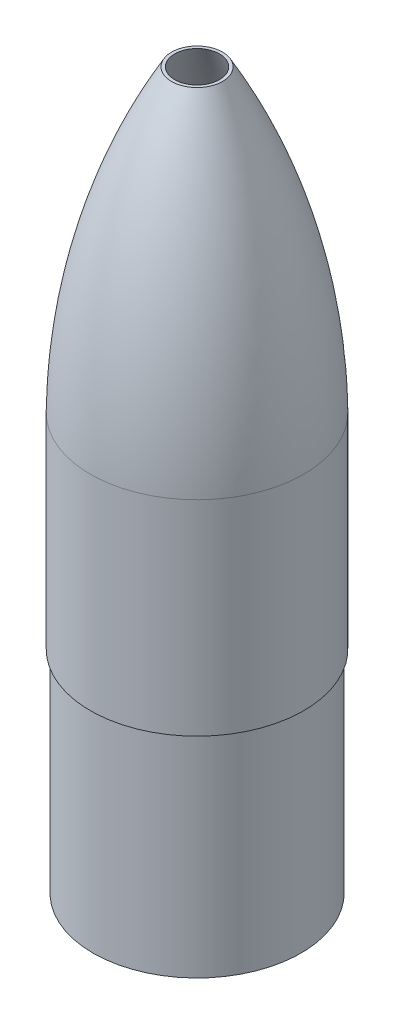
ISO-10303-21;
HEADER;
FILE_DESCRIPTION(('STEP AP214'),'2;1');
FILE_NAME('part.step','',(''),(''),'','','');
FILE_SCHEMA(('AUTOMOTIVE_DESIGN { 1 0 10303 214 1 1 1 1 }'));
ENDSEC;
DATA;
#1=APPLICATION_CONTEXT('core data for automotive mechanical design processes');
#2=APPLICATION_PROTOCOL_DEFINITION('international standard','automotive_design',2000,#1);
#3=PRODUCT_CONTEXT('',#1,'mechanical');
#4=PRODUCT('Part','Part','',(#3));
#5=PRODUCT_RELATED_PRODUCT_CATEGORY('part','',(#4));
#6=PRODUCT_DEFINITION_FORMATION('','',#4);
#7=PRODUCT_DEFINITION_CONTEXT('part definition',#1,'design');
#8=PRODUCT_DEFINITION('design','',#6,#7);
#9=PRODUCT_DEFINITION_SHAPE('','',#8);
#10=(LENGTH_UNIT() NAMED_UNIT(*) SI_UNIT(.MILLI.,.METRE.));
#11=(NAMED_UNIT(*) PLANE_ANGLE_UNIT() SI_UNIT($,.RADIAN.));
#12=(NAMED_UNIT(*) SI_UNIT($,.STERADIAN.) SOLID_ANGLE_UNIT());
#13=UNCERTAINTY_MEASURE_WITH_UNIT(LENGTH_MEASURE(1.E-05),#10,'distance_accuracy_value','');
#14=(GEOMETRIC_REPRESENTATION_CONTEXT(3) GLOBAL_UNCERTAINTY_ASSIGNED_CONTEXT((#13)) GLOBAL_UNIT_ASSIGNED_CONTEXT((#10,
#11,#12)) REPRESENTATION_CONTEXT('',''));
#15=CARTESIAN_POINT('',(0.,0.,0.));
#16=DIRECTION('',(0.,0.,1.));
#17=DIRECTION('',(1.,0.,0.));
#18=AXIS2_PLACEMENT_3D('',#15,#16,#17);
#19=CARTESIAN_POINT('',(78.16,0.555796301470041,0.));
#20=DIRECTION('',(0.,1.,0.));
#21=DIRECTION('',(0.,0.,1.));
#22=AXIS2_PLACEMENT_3D('',#19,#20,#21);
#23=PLANE('',#22);
#24=CARTESIAN_POINT('',(0.,0.555796301470041,0.));
#25=DIRECTION('',(0.,-1.,0.));
#26=DIRECTION('',(0.,0.,-1.));
#27=AXIS2_PLACEMENT_3D('',#24,#25,#26);
#28=CIRCLE('',#27,76.2);
#29=CARTESIAN_POINT('',(0.,0.555796301470041,76.2));
#30=VERTEX_POINT('',#29);
#31=EDGE_CURVE('E44',#30,#30,#28,.T.);
#32=ORIENTED_EDGE('',*,*,#31,.F.);
#33=EDGE_LOOP('',(#32));
#34=FACE_BOUND('',#33,.T.);
#35=CARTESIAN_POINT('',(0.,0.555796301470041,0.));
#36=DIRECTION('',(0.,-1.,0.));
#37=DIRECTION('',(0.,0.,-1.));
#38=AXIS2_PLACEMENT_3D('',#35,#36,#37);
#39=CIRCLE('',#38,78.16);
#40=CARTESIAN_POINT('',(0.,0.555796301470041,-78.16));
#41=VERTEX_POINT('',#40);
#42=EDGE_CURVE('E48',#41,#41,#39,.T.);
#43=ORIENTED_EDGE('',*,*,#42,.T.);
#44=EDGE_LOOP('',(#43));
#45=FACE_BOUND('',#44,.T.);
#46=ADVANCED_FACE('F35',(#34,#45),#23,.F.);
#47=CARTESIAN_POINT('',(0.,-198.817850362013,0.));
#48=DIRECTION('',(0.,-1.,0.));
#49=DIRECTION('',(0.,0.,-1.));
#50=AXIS2_PLACEMENT_3D('',#47,#48,#49);
#51=CYLINDRICAL_SURFACE('',#50,78.1600000000358);
#52=CARTESIAN_POINT('',(0.,150.555796301473,0.));
#53=DIRECTION('',(0.,-1.,0.));
#54=DIRECTION('',(0.,0.,-1.));
#55=AXIS2_PLACEMENT_3D('',#52,#53,#54);
#56=CIRCLE('',#55,78.1600000000715);
#57=CARTESIAN_POINT('',(0.,150.555796301473,-78.1600000000715));
#58=VERTEX_POINT('',#57);
#59=EDGE_CURVE('E53',#58,#58,#56,.T.);
#60=ORIENTED_EDGE('',*,*,#59,.T.);
#61=EDGE_LOOP('',(#60));
#62=FACE_BOUND('',#61,.T.);
#63=ORIENTED_EDGE('',*,*,#42,.F.);
#64=EDGE_LOOP('',(#63));
#65=FACE_BOUND('',#64,.T.);
#66=ADVANCED_FACE('F73',(#62,#65),#51,.T.);
#67=CARTESIAN_POINT('',(-3.54100248339668E-12,400.000000000019,0.));
#68=CARTESIAN_POINT('',(0.211335821958616,399.688125950539,0.));
#69=CARTESIAN_POINT('',(0.635814894562518,399.059576984409,0.));
#70=CARTESIAN_POINT('',(1.53810090052568,397.718447681961,0.));
#71=CARTESIAN_POINT('',(2.52221613507973,396.240558987734,0.));
#72=CARTESIAN_POINT('',(3.50564466868426,394.750882712349,0.));
#73=CARTESIAN_POINT('',(4.50102199868809,393.230772914196,0.));
#74=CARTESIAN_POINT('',(5.4827943041934,391.71794087494,0.));
#75=CARTESIAN_POINT('',(6.46000248743205,390.19904570004,0.));
#76=CARTESIAN_POINT('',(7.43650349854647,388.667903295333,0.));
#77=CARTESIAN_POINT('',(8.4121022457302,387.124567018183,0.));
#78=CARTESIAN_POINT('',(16.4913500878684,374.22880624377,0.));
#79=CARTESIAN_POINT('',(28.3480453483549,353.344444450607,0.));
#80=CARTESIAN_POINT('',(42.541088502936,323.752786495737,0.));
#81=CARTESIAN_POINT('',(57.5292348684686,282.998416237217,0.));
#82=CARTESIAN_POINT('',(68.4497658514673,242.872883660801,0.));
#83=CARTESIAN_POINT('',(74.1096057925069,210.076821303206,0.));
#84=CARTESIAN_POINT('',(76.6558528313221,184.808563000174,0.));
#85=CARTESIAN_POINT('',(77.5184653449877,170.067485067453,0.));
#86=CARTESIAN_POINT('',(77.6804449630636,166.851372886379,0.));
#87=CARTESIAN_POINT('',(77.8001932895896,164.105278721716,0.));
#88=CARTESIAN_POINT('',(77.8720372450868,162.290675769843,0.));
#89=CARTESIAN_POINT('',(77.9363116933117,160.485721022509,0.));
#90=CARTESIAN_POINT('',(77.9933778731587,158.683168323446,0.));
#91=CARTESIAN_POINT('',(78.0434262939293,156.86674010455,0.));
#92=CARTESIAN_POINT('',(78.0859142616916,155.082628956294,0.));
#93=CARTESIAN_POINT('',(78.1211275278516,153.306463123379,0.));
#94=CARTESIAN_POINT('',(78.1454756434559,151.691137071132,0.));
#95=CARTESIAN_POINT('',(78.1555779520431,150.932503957013,0.));
#96=CARTESIAN_POINT('',(78.1600000000715,150.555796301473,0.));
#97=B_SPLINE_CURVE_WITH_KNOTS('',4,(#67,#68,#69,#70,#71,#72,#73,#74,#75,#76,#77,#78,#79,#80,#81,
#82,#83,#84,#85,#86,#87,#88,#89,#90,#91,#92,#93,#94,#95,#96),.UNSPECIFIED.,.F.,.F.,(5,1,1,1,1,1,
1,1,1,1,1,1,1,1,1,1,1,1,1,1,1,1,1,1,1,1,5),(0.0826164282316582,0.088299706346032,
0.0939829844604058,0.0996662625747796,0.105349540689153,0.111032818803527,0.116716096917901,
0.122399375032275,0.128082653146649,0.133891141901002,0.139699630655356,0.313954310904782,
0.430124091568336,0.546293874226719,0.68569761210705,0.836718331478718,0.84833530900807,
0.865760775302099,0.871569264066775,0.877252541384307,0.882935818701838,0.88861909601937,
0.894302373336902,0.899985650654434,0.905668927971966,0.911352205289498,0.91703548260703),.UNSPECIFIED.);
#98=CARTESIAN_POINT('',(0.,-198.817850362013,0.));
#99=DIRECTION('',(0.,-1.,0.));
#100=AXIS1_PLACEMENT('',#98,#99);
#101=SURFACE_OF_REVOLUTION('',#97,#100);
#102=CARTESIAN_POINT('',(0.,370.000000000019,0.));
#103=DIRECTION('',(0.,-1.,0.));
#104=DIRECTION('',(0.,0.,-1.));
#105=AXIS2_PLACEMENT_3D('',#102,#103,#104);
#106=CIRCLE('',#105,18.6686027201573);
#107=CARTESIAN_POINT('',(0.,370.000000000019,-18.6686027201573));
#108=VERTEX_POINT('',#107);
#109=EDGE_CURVE('E108',#108,#108,#106,.T.);
#110=ORIENTED_EDGE('',*,*,#109,.T.);
#111=EDGE_LOOP('',(#110));
#112=FACE_BOUND('',#111,.T.);
#113=ORIENTED_EDGE('',*,*,#59,.F.);
#114=EDGE_LOOP('',(#113));
#115=FACE_BOUND('',#114,.T.);
#116=ADVANCED_FACE('F68',(#112,#115),#101,.T.);
#117=CARTESIAN_POINT('',(0.,150.555796301473,0.));
#118=DIRECTION('',(0.,1.,0.));
#119=DIRECTION('',(0.,0.,1.));
#120=AXIS2_PLACEMENT_3D('',#117,#118,#119);
#121=PLANE('',#120);
#122=CARTESIAN_POINT('',(0.,150.555796301473,0.));
#123=DIRECTION('',(0.,1.,0.));
#124=DIRECTION('',(0.,0.,1.));
#125=AXIS2_PLACEMENT_3D('',#122,#123,#124);
#126=CIRCLE('',#125,73.2);
#127=CARTESIAN_POINT('',(0.,150.555796301473,73.2));
#128=VERTEX_POINT('',#127);
#129=EDGE_CURVE('E104',#128,#128,#126,.T.);
#130=ORIENTED_EDGE('',*,*,#129,.F.);
#131=EDGE_LOOP('',(#130));
#132=FACE_BOUND('',#131,.T.);
#133=CARTESIAN_POINT('',(0.,150.555796301473,0.));
#134=DIRECTION('',(0.,-1.,0.));
#135=DIRECTION('',(0.,0.,-1.));
#136=AXIS2_PLACEMENT_3D('',#133,#134,#135);
#137=CIRCLE('',#136,76.1998641449919);
#138=CARTESIAN_POINT('',(0.,150.555796301473,-76.1998641449919));
#139=VERTEX_POINT('',#138);
#140=EDGE_CURVE('E10',#139,#139,#137,.F.);
#141=ORIENTED_EDGE('',*,*,#140,.T.);
#142=EDGE_LOOP('',(#141));
#143=FACE_BOUND('',#142,.T.);
#144=ADVANCED_FACE('F72',(#132,#143),#121,.T.);
#145=CARTESIAN_POINT('',(0.,-154.244203698527,0.));
#146=DIRECTION('',(0.,1.,0.));
#147=DIRECTION('',(0.,0.,1.));
#148=AXIS2_PLACEMENT_3D('',#145,#146,#147);
#149=CYLINDRICAL_SURFACE('',#148,76.2);
#150=CARTESIAN_POINT('',(0.,-154.244203698527,0.));
#151=DIRECTION('',(0.,1.,0.));
#152=DIRECTION('',(0.,0.,1.));
#153=AXIS2_PLACEMENT_3D('',#150,#151,#152);
#154=CIRCLE('',#153,76.2);
#155=CARTESIAN_POINT('',(0.,-154.244203698527,76.2));
#156=VERTEX_POINT('',#155);
#157=EDGE_CURVE('E56',#156,#156,#154,.T.);
#158=CARTESIAN_POINT('',(0.,-154.244203698527,76.2));
#159=CARTESIAN_POINT('',(0.,-152.631703698527,76.2));
#160=CARTESIAN_POINT('',(0.,-151.019203698527,76.2));
#161=CARTESIAN_POINT('',(0.,-147.794203698527,76.2));
#162=CARTESIAN_POINT('',(0.,-146.181703698527,76.2));
#163=CARTESIAN_POINT('',(0.,-142.956703698527,76.2));
#164=CARTESIAN_POINT('',(0.,-141.344203698527,76.2));
#165=CARTESIAN_POINT('',(0.,-138.119203698527,76.2));
#166=CARTESIAN_POINT('',(0.,-136.506703698527,76.2));
#167=CARTESIAN_POINT('',(0.,-133.281703698528,76.2));
#168=CARTESIAN_POINT('',(0.,-131.669203698528,76.2));
#169=CARTESIAN_POINT('',(0.,-128.444203698528,76.2));
#170=CARTESIAN_POINT('',(0.,-126.831703698528,76.2));
#171=CARTESIAN_POINT('',(0.,-123.606703698528,76.2));
#172=CARTESIAN_POINT('',(0.,-121.994203698528,76.2));
#173=CARTESIAN_POINT('',(0.,-118.769203698528,76.2));
#174=CARTESIAN_POINT('',(0.,-117.156703698528,76.2));
#175=CARTESIAN_POINT('',(0.,-113.931703698528,76.2));
#176=CARTESIAN_POINT('',(0.,-112.319203698528,76.2));
#177=CARTESIAN_POINT('',(0.,-109.094203698528,76.2));
#178=CARTESIAN_POINT('',(0.,-107.481703698528,76.2));
#179=CARTESIAN_POINT('',(0.,-104.256703698528,76.2));
#180=CARTESIAN_POINT('',(0.,-102.644203698528,76.2));
#181=CARTESIAN_POINT('',(0.,-99.4192036985282,76.2));
#182=CARTESIAN_POINT('',(0.,-97.8067036985282,76.2));
#183=CARTESIAN_POINT('',(0.,-94.5817036985282,76.2));
#184=CARTESIAN_POINT('',(0.,-92.9692036985283,76.2));
#185=CARTESIAN_POINT('',(0.,-89.7442036985283,76.2));
#186=CARTESIAN_POINT('',(0.,-88.1317036985284,76.2));
#187=CARTESIAN_POINT('',(0.,-84.9067036985284,76.2));
#188=CARTESIAN_POINT('',(0.,-83.2942036985284,76.2));
#189=CARTESIAN_POINT('',(0.,-80.0692036985285,76.2));
#190=CARTESIAN_POINT('',(0.,-78.4567036985285,76.2));
#191=CARTESIAN_POINT('',(0.,-75.2317036985286,76.2));
#192=CARTESIAN_POINT('',(0.,-73.6192036985286,76.2));
#193=CARTESIAN_POINT('',(0.,-70.3942036985287,76.2));
#194=CARTESIAN_POINT('',(0.,-68.7817036985287,76.2));
#195=CARTESIAN_POINT('',(0.,-65.5567036985288,76.2));
#196=CARTESIAN_POINT('',(0.,-63.9442036985288,76.2));
#197=CARTESIAN_POINT('',(0.,-60.7192036985288,76.2));
#198=CARTESIAN_POINT('',(0.,-59.1067036985289,76.2));
#199=CARTESIAN_POINT('',(0.,-55.8817036985289,76.2));
#200=CARTESIAN_POINT('',(0.,-54.269203698529,76.2));
#201=CARTESIAN_POINT('',(0.,-51.044203698529,76.2));
#202=CARTESIAN_POINT('',(0.,-49.431703698529,76.2));
#203=CARTESIAN_POINT('',(0.,-46.2067036985291,76.2));
#204=CARTESIAN_POINT('',(0.,-44.5942036985291,76.2));
#205=CARTESIAN_POINT('',(0.,-41.3692036985292,76.2));
#206=CARTESIAN_POINT('',(0.,-39.7567036985292,76.2));
#207=CARTESIAN_POINT('',(0.,-36.5317036985293,76.2));
#208=CARTESIAN_POINT('',(0.,-34.9192036985293,76.2));
#209=CARTESIAN_POINT('',(0.,-31.6942036985294,76.2));
#210=CARTESIAN_POINT('',(0.,-30.0817036985294,76.2));
#211=CARTESIAN_POINT('',(0.,-26.8567036985295,76.2));
#212=CARTESIAN_POINT('',(0.,-25.2442036985295,76.2));
#213=CARTESIAN_POINT('',(0.,-22.0192036985295,76.2));
#214=CARTESIAN_POINT('',(0.,-20.4067036985296,76.2));
#215=CARTESIAN_POINT('',(0.,-17.1817036985296,76.2));
#216=CARTESIAN_POINT('',(0.,-15.5692036985297,76.2));
#217=CARTESIAN_POINT('',(0.,-12.3442036985297,76.2));
#218=CARTESIAN_POINT('',(0.,-10.7317036985298,76.2));
#219=CARTESIAN_POINT('',(0.,-7.50670369852981,76.2));
#220=CARTESIAN_POINT('',(0.,-5.89420369852984,76.2));
#221=CARTESIAN_POINT('',(0.,-2.6692036985299,76.2));
#222=CARTESIAN_POINT('',(0.,-1.05670369852993,76.2));
#223=CARTESIAN_POINT('',(0.,0.555796301470041,76.2));
#224=B_SPLINE_CURVE_WITH_KNOTS('',3,(#158,#159,#160,#161,#162,#163,#164,#165,#166,#167,#168,
#169,#170,#171,#172,#173,#174,#175,#176,#177,#178,#179,#180,#181,#182,#183,#184,#185,#186,#187,
#188,#189,#190,#191,#192,#193,#194,#195,#196,#197,#198,#199,#200,#201,#202,#203,#204,#205,#206,
#207,#208,#209,#210,#211,#212,#213,#214,#215,#216,#217,#218,#219,#220,#221,#222,#223),
.UNSPECIFIED.,.F.,.F.,(4,2,2,2,2,2,2,2,2,2,2,2,2,2,2,2,2,2,2,2,2,2,2,2,2,2,2,2,2,2,2,2,4),(0.,
4.83749999999994,9.67499999999985,14.5124999999998,19.3499999999997,24.1874999999996,
29.0249999999995,33.8624999999994,38.6999999999993,43.5374999999992,48.3749999999991,
53.2124999999991,58.049999999999,62.8874999999989,67.7249999999988,72.5624999999987,
77.3999999999986,82.2374999999985,87.0749999999984,91.9124999999984,96.7499999999983,
101.587499999998,106.424999999998,111.262499999998,116.099999999998,120.937499999998,
125.774999999998,130.612499999998,135.449999999998,140.287499999997,145.124999999997,
149.962499999997,154.799999999997),.UNSPECIFIED.);
#225=EDGE_CURVE('BSEAM75',#156,#30,#224,.T.);
#226=ORIENTED_EDGE('',*,*,#157,.T.);
#227=ORIENTED_EDGE('',*,*,#31,.T.);
#228=ORIENTED_EDGE('',*,*,#225,.T.);
#229=ORIENTED_EDGE('',*,*,#225,.F.);
#230=EDGE_LOOP('',(#226,#228,#227,#229));
#231=FACE_BOUND('',#230,.T.);
#232=ADVANCED_FACE('F75',(#231),#149,.T.);
#233=CARTESIAN_POINT('',(0.,-154.244203698527,0.));
#234=DIRECTION('',(0.,1.,0.));
#235=DIRECTION('',(0.,0.,1.));
#236=AXIS2_PLACEMENT_3D('',#233,#234,#235);
#237=PLANE('',#236);
#238=CARTESIAN_POINT('',(0.,-154.244203698527,0.));
#239=DIRECTION('',(0.,1.,0.));
#240=DIRECTION('',(0.,0.,1.));
#241=AXIS2_PLACEMENT_3D('',#238,#239,#240);
#242=CIRCLE('',#241,73.2);
#243=CARTESIAN_POINT('',(0.,-154.244203698527,73.2));
#244=VERTEX_POINT('',#243);
#245=EDGE_CURVE('E102',#244,#244,#242,.T.);
#246=ORIENTED_EDGE('',*,*,#245,.T.);
#247=EDGE_LOOP('',(#246));
#248=FACE_BOUND('',#247,.T.);
#249=ORIENTED_EDGE('',*,*,#157,.F.);
#250=EDGE_LOOP('',(#249));
#251=FACE_BOUND('',#250,.T.);
#252=ADVANCED_FACE('F89',(#248,#251),#237,.F.);
#253=CARTESIAN_POINT('',(0.,-154.244203698527,0.));
#254=DIRECTION('',(0.,1.,0.));
#255=DIRECTION('',(0.,0.,1.));
#256=AXIS2_PLACEMENT_3D('',#253,#254,#255);
#257=CYLINDRICAL_SURFACE('',#256,73.2);
#258=CARTESIAN_POINT('',(0.,-154.244203698527,73.2));
#259=CARTESIAN_POINT('',(0.,-151.069203698527,73.2));
#260=CARTESIAN_POINT('',(0.,-147.894203698527,73.2));
#261=CARTESIAN_POINT('',(0.,-141.544203698527,73.2));
#262=CARTESIAN_POINT('',(0.,-138.369203698527,73.2));
#263=CARTESIAN_POINT('',(0.,-132.019203698527,73.2));
#264=CARTESIAN_POINT('',(0.,-128.844203698527,73.2));
#265=CARTESIAN_POINT('',(0.,-122.494203698527,73.2));
#266=CARTESIAN_POINT('',(0.,-119.319203698527,73.2));
#267=CARTESIAN_POINT('',(0.,-112.969203698527,73.2));
#268=CARTESIAN_POINT('',(0.,-109.794203698527,73.2));
#269=CARTESIAN_POINT('',(0.,-103.444203698527,73.2));
#270=CARTESIAN_POINT('',(0.,-100.269203698527,73.2));
#271=CARTESIAN_POINT('',(0.,-93.9192036985272,73.2));
#272=CARTESIAN_POINT('',(0.,-90.7442036985272,73.2));
#273=CARTESIAN_POINT('',(0.,-84.3942036985272,73.2));
#274=CARTESIAN_POINT('',(0.,-81.2192036985272,73.2));
#275=CARTESIAN_POINT('',(0.,-74.8692036985272,73.2));
#276=CARTESIAN_POINT('',(0.,-71.6942036985271,73.2));
#277=CARTESIAN_POINT('',(0.,-65.3442036985272,73.2));
#278=CARTESIAN_POINT('',(0.,-62.1692036985271,73.2));
#279=CARTESIAN_POINT('',(0.,-55.8192036985271,73.2));
#280=CARTESIAN_POINT('',(0.,-52.6442036985271,73.2));
#281=CARTESIAN_POINT('',(0.,-46.2942036985271,73.2));
#282=CARTESIAN_POINT('',(0.,-43.1192036985272,73.2));
#283=CARTESIAN_POINT('',(0.,-36.7692036985271,73.2));
#284=CARTESIAN_POINT('',(0.,-33.5942036985271,73.2));
#285=CARTESIAN_POINT('',(0.,-27.2442036985271,73.2));
#286=CARTESIAN_POINT('',(0.,-24.0692036985272,73.2));
#287=CARTESIAN_POINT('',(0.,-17.7192036985272,73.2));
#288=CARTESIAN_POINT('',(0.,-14.5442036985272,73.2));
#289=CARTESIAN_POINT('',(0.,-8.19420369852715,73.2));
#290=CARTESIAN_POINT('',(0.,-5.01920369852714,73.2));
#291=CARTESIAN_POINT('',(0.,1.33079630147286,73.2));
#292=CARTESIAN_POINT('',(0.,4.50579630147286,73.2));
#293=CARTESIAN_POINT('',(0.,10.8557963014729,73.2));
#294=CARTESIAN_POINT('',(0.,14.0307963014729,73.2));
#295=CARTESIAN_POINT('',(0.,20.3807963014729,73.2));
#296=CARTESIAN_POINT('',(0.,23.5557963014729,73.2));
#297=CARTESIAN_POINT('',(0.,29.9057963014729,73.2));
#298=CARTESIAN_POINT('',(0.,33.0807963014729,73.2));
#299=CARTESIAN_POINT('',(0.,39.4307963014729,73.2));
#300=CARTESIAN_POINT('',(0.,42.6057963014729,73.2));
#301=CARTESIAN_POINT('',(0.,48.9557963014729,73.2));
#302=CARTESIAN_POINT('',(0.,52.1307963014729,73.2));
#303=CARTESIAN_POINT('',(0.,58.4807963014729,73.2));
#304=CARTESIAN_POINT('',(0.,61.6557963014729,73.2));
#305=CARTESIAN_POINT('',(0.,68.0057963014729,73.2));
#306=CARTESIAN_POINT('',(0.,71.1807963014729,73.2));
#307=CARTESIAN_POINT('',(0.,77.5307963014729,73.2));
#308=CARTESIAN_POINT('',(0.,80.7057963014729,73.2));
#309=CARTESIAN_POINT('',(0.,87.0557963014729,73.2));
#310=CARTESIAN_POINT('',(0.,90.2307963014729,73.2));
#311=CARTESIAN_POINT('',(0.,96.5807963014729,73.2));
#312=CARTESIAN_POINT('',(0.,99.7557963014729,73.2));
#313=CARTESIAN_POINT('',(0.,106.105796301473,73.2));
#314=CARTESIAN_POINT('',(0.,109.280796301473,73.2));
#315=CARTESIAN_POINT('',(0.,115.630796301473,73.2));
#316=CARTESIAN_POINT('',(0.,118.805796301473,73.2));
#317=CARTESIAN_POINT('',(0.,125.155796301473,73.2));
#318=CARTESIAN_POINT('',(0.,128.330796301473,73.2));
#319=CARTESIAN_POINT('',(0.,134.680796301473,73.2));
#320=CARTESIAN_POINT('',(0.,137.855796301473,73.2));
#321=CARTESIAN_POINT('',(0.,144.205796301473,73.2));
#322=CARTESIAN_POINT('',(0.,147.380796301473,73.2));
#323=CARTESIAN_POINT('',(0.,150.555796301473,73.2));
#324=B_SPLINE_CURVE_WITH_KNOTS('',3,(#258,#259,#260,#261,#262,#263,#264,#265,#266,#267,#268,
#269,#270,#271,#272,#273,#274,#275,#276,#277,#278,#279,#280,#281,#282,#283,#284,#285,#286,#287,
#288,#289,#290,#291,#292,#293,#294,#295,#296,#297,#298,#299,#300,#301,#302,#303,#304,#305,#306,
#307,#308,#309,#310,#311,#312,#313,#314,#315,#316,#317,#318,#319,#320,#321,#322,#323),
.UNSPECIFIED.,.F.,.F.,(4,2,2,2,2,2,2,2,2,2,2,2,2,2,2,2,2,2,2,2,2,2,2,2,2,2,2,2,2,2,2,2,4),(0.,
9.52499999999998,19.05,28.575,38.1,47.625,57.15,66.675,76.2,85.725,95.25,104.775,114.3,123.825,
133.35,142.875,152.4,161.925,171.45,180.975,190.5,200.025,209.55,219.075,228.6,238.125,247.65,
257.175,266.7,276.225,285.75,295.275,304.8),.UNSPECIFIED.);
#325=EDGE_CURVE('BSEAM95',#244,#128,#324,.T.);
#326=ORIENTED_EDGE('',*,*,#245,.F.);
#327=ORIENTED_EDGE('',*,*,#129,.T.);
#328=ORIENTED_EDGE('',*,*,#325,.T.);
#329=ORIENTED_EDGE('',*,*,#325,.F.);
#330=EDGE_LOOP('',(#326,#328,#327,#329));
#331=FACE_BOUND('',#330,.T.);
#332=ADVANCED_FACE('F95',(#331),#257,.F.);
#333=CARTESIAN_POINT('',(-1.62256043989055,398.900501196498,0.));
#334=CARTESIAN_POINT('',(-1.4527020894745,398.649836585593,0.));
#335=CARTESIAN_POINT('',(-1.13860808070098,398.184925348062,0.));
#336=CARTESIAN_POINT('',(-0.519571460509534,397.265098357085,0.));
#337=CARTESIAN_POINT('',(0.109915813093936,396.325662034573,0.));
#338=CARTESIAN_POINT('',(0.68726923948598,395.458986867615,0.));
#339=CARTESIAN_POINT('',(1.24825679470018,394.612262216911,0.));
#340=CARTESIAN_POINT('',(1.99947891626582,393.472916561613,0.));
#341=CARTESIAN_POINT('',(3.3229903667817,391.451301251463,0.));
#342=CARTESIAN_POINT('',(5.18273421888216,388.56710601319,0.));
#343=CARTESIAN_POINT('',(9.59209674620897,381.590651126644,0.));
#344=CARTESIAN_POINT('',(18.7944887803775,366.267083025943,0.));
#345=CARTESIAN_POINT('',(36.7943052947311,332.203153979153,0.));
#346=CARTESIAN_POINT('',(57.076508975067,280.924103704226,0.));
#347=CARTESIAN_POINT('',(69.6847325969288,227.24042529235,0.));
#348=CARTESIAN_POINT('',(74.343019544348,188.9958444344,0.));
#349=CARTESIAN_POINT('',(75.5309515534069,171.160960640689,0.));
#350=CARTESIAN_POINT('',(75.8913495939715,162.915707976901,0.));
#351=CARTESIAN_POINT('',(76.0100982186272,159.486050775157,0.));
#352=CARTESIAN_POINT('',(76.0769403496039,157.070550777706,0.));
#353=CARTESIAN_POINT('',(76.1102467073511,155.706228582079,0.));
#354=CARTESIAN_POINT('',(76.1327803120506,154.690650433653,0.));
#355=CARTESIAN_POINT('',(76.1532510311831,153.650034533213,0.));
#356=CARTESIAN_POINT('',(76.1724217564322,152.520648043593,0.));
#357=CARTESIAN_POINT('',(76.1890273263125,151.409738143698,0.));
#358=CARTESIAN_POINT('',(76.1964277692495,150.847643517066,0.));
#359=CARTESIAN_POINT('',(76.2,150.544274919865,0.));
#360=B_SPLINE_CURVE_WITH_KNOTS('',3,(#333,#334,#335,#336,#337,#338,#339,#340,#341,#342,#343,
#344,#345,#346,#347,#348,#349,#350,#351,#352,#353,#354,#355,#356,#357,#358,#359),.UNSPECIFIED.,
.F.,.F.,(4,1,1,1,1,1,1,1,1,1,1,1,1,1,1,1,1,1,1,1,1,1,1,1,4),(0.0826164282316582,
0.0858757074160786,0.0891349866004989,0.0923942657849193,0.0956535449693396,0.09891282415376,
0.10217210333818,0.108690661707021,0.121727778444703,0.134764895182384,0.18691336213311,
0.291210296034561,0.499804163837465,0.708398031640368,0.81269496554182,0.864843432492545,
0.877880549230227,0.890917665967908,0.897436224336749,0.900695503521169,0.90395478270559,
0.90721406189001,0.910473341074431,0.913732620258851,0.916991899443271),.UNSPECIFIED.);
#361=CARTESIAN_POINT('',(0.,-198.817850362013,0.));
#362=DIRECTION('',(0.,-1.,0.));
#363=AXIS1_PLACEMENT('',#361,#362);
#364=SURFACE_OF_REVOLUTION('',#360,#363);
#365=CARTESIAN_POINT('',(0.,370.000000000019,0.));
#366=DIRECTION('',(0.,-1.,0.));
#367=DIRECTION('',(0.,0.,-1.));
#368=AXIS2_PLACEMENT_3D('',#365,#366,#367);
#369=CIRCLE('',#368,16.4113904058644);
#370=CARTESIAN_POINT('',(0.,370.000000000019,-16.4113904058644));
#371=VERTEX_POINT('',#370);
#372=EDGE_CURVE('E40',#371,#371,#369,.T.);
#373=ORIENTED_EDGE('',*,*,#372,.F.);
#374=EDGE_LOOP('',(#373));
#375=FACE_BOUND('',#374,.T.);
#376=ORIENTED_EDGE('',*,*,#140,.F.);
#377=EDGE_LOOP('',(#376));
#378=FACE_BOUND('',#377,.T.);
#379=ADVANCED_FACE('F37',(#375,#378),#364,.F.);
#380=CARTESIAN_POINT('',(-3.54100248339668E-12,370.000000000019,0.));
#381=DIRECTION('',(0.,-1.,0.));
#382=DIRECTION('',(0.,0.,-1.));
#383=AXIS2_PLACEMENT_3D('',#380,#381,#382);
#384=PLANE('',#383);
#385=ORIENTED_EDGE('',*,*,#372,.T.);
#386=EDGE_LOOP('',(#385));
#387=FACE_BOUND('',#386,.T.);
#388=ORIENTED_EDGE('',*,*,#109,.F.);
#389=EDGE_LOOP('',(#388));
#390=FACE_BOUND('',#389,.T.);
#391=ADVANCED_FACE('F115',(#387,#390),#384,.F.);
#392=CLOSED_SHELL('',(#46,#66,#116,#144,#232,#252,#332,#379,#391));
#393=MANIFOLD_SOLID_BREP('B2',#392);
#394=ADVANCED_BREP_SHAPE_REPRESENTATION('',(#18,#393),#14);
#395=SHAPE_DEFINITION_REPRESENTATION(#9,#394);
ENDSEC;
END-ISO-10303-21;
